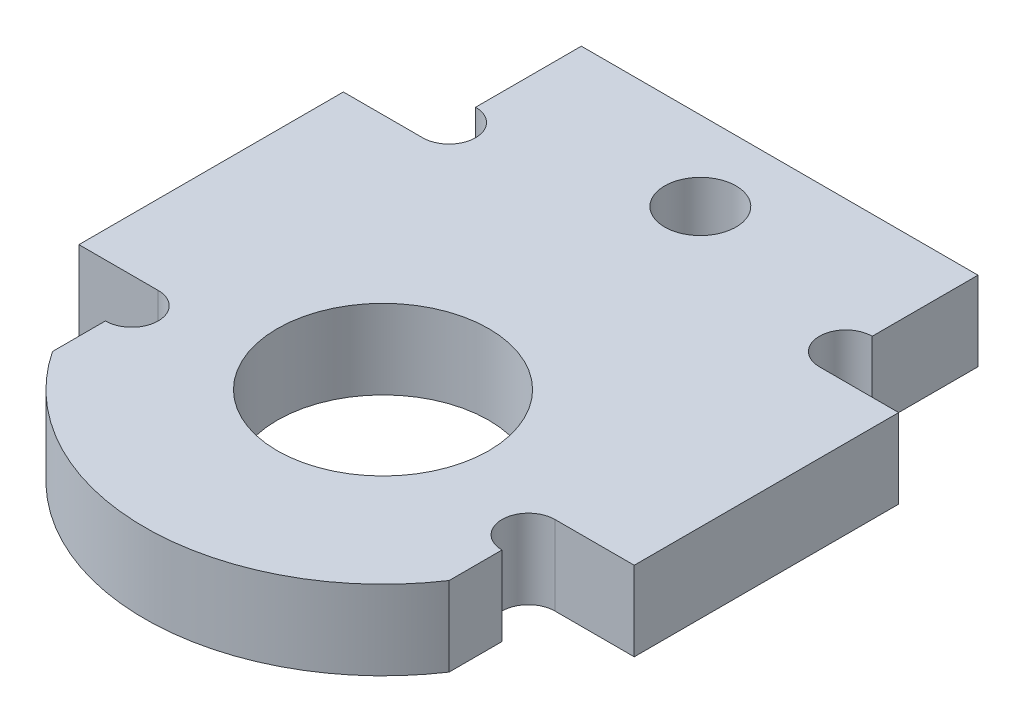
ISO-10303-21;
HEADER;
FILE_DESCRIPTION(('STEP AP214'),'2;1');
FILE_NAME('part.step','',(''),(''),'','','');
FILE_SCHEMA(('AUTOMOTIVE_DESIGN { 1 0 10303 214 1 1 1 1 }'));
ENDSEC;
DATA;
#1=APPLICATION_CONTEXT('core data for automotive mechanical design processes');
#2=APPLICATION_PROTOCOL_DEFINITION('international standard','automotive_design',2000,#1);
#3=PRODUCT_CONTEXT('',#1,'mechanical');
#4=PRODUCT('Part','Part','',(#3));
#5=PRODUCT_RELATED_PRODUCT_CATEGORY('part','',(#4));
#6=PRODUCT_DEFINITION_FORMATION('','',#4);
#7=PRODUCT_DEFINITION_CONTEXT('part definition',#1,'design');
#8=PRODUCT_DEFINITION('design','',#6,#7);
#9=PRODUCT_DEFINITION_SHAPE('','',#8);
#10=(LENGTH_UNIT() NAMED_UNIT(*) SI_UNIT(.MILLI.,.METRE.));
#11=(NAMED_UNIT(*) PLANE_ANGLE_UNIT() SI_UNIT($,.RADIAN.));
#12=(NAMED_UNIT(*) SI_UNIT($,.STERADIAN.) SOLID_ANGLE_UNIT());
#13=UNCERTAINTY_MEASURE_WITH_UNIT(LENGTH_MEASURE(1.E-05),#10,'distance_accuracy_value','');
#14=(GEOMETRIC_REPRESENTATION_CONTEXT(3) GLOBAL_UNCERTAINTY_ASSIGNED_CONTEXT((#13)) GLOBAL_UNIT_ASSIGNED_CONTEXT((#10,
#11,#12)) REPRESENTATION_CONTEXT('',''));
#15=CARTESIAN_POINT('',(0.,0.,0.));
#16=DIRECTION('',(0.,0.,1.));
#17=DIRECTION('',(1.,0.,0.));
#18=AXIS2_PLACEMENT_3D('',#15,#16,#17);
#19=CARTESIAN_POINT('',(7.5,3.,0.));
#20=DIRECTION('',(-1.,0.,0.));
#21=DIRECTION('',(0.,0.,1.));
#22=AXIS2_PLACEMENT_3D('',#19,#20,#21);
#23=PLANE('',#22);
#24=DIRECTION('',(0.,0.,-1.));
#25=VECTOR('',#24,1.);
#26=CARTESIAN_POINT('',(7.5,3.,0.));
#27=LINE('',#26,#25);
#28=CARTESIAN_POINT('',(7.5,3.,-11.));
#29=VERTEX_POINT('',#28);
#30=CARTESIAN_POINT('',(7.5,3.,-15.));
#31=VERTEX_POINT('',#30);
#32=EDGE_CURVE('E164',#29,#31,#27,.T.);
#33=ORIENTED_EDGE('',*,*,#32,.F.);
#34=DIRECTION('',(0.,-1.,0.));
#35=VECTOR('',#34,1.);
#36=CARTESIAN_POINT('',(7.5,3.,-11.));
#37=LINE('',#36,#35);
#38=CARTESIAN_POINT('',(7.5,0.,-11.));
#39=VERTEX_POINT('',#38);
#40=EDGE_CURVE('E149',#29,#39,#37,.T.);
#41=ORIENTED_EDGE('',*,*,#40,.T.);
#42=DIRECTION('',(0.,0.,-1.));
#43=VECTOR('',#42,1.);
#44=CARTESIAN_POINT('',(7.5,0.,0.));
#45=LINE('',#44,#43);
#46=CARTESIAN_POINT('',(7.5,0.,-15.));
#47=VERTEX_POINT('',#46);
#48=EDGE_CURVE('E162',#39,#47,#45,.T.);
#49=ORIENTED_EDGE('',*,*,#48,.T.);
#50=DIRECTION('',(0.,1.,0.));
#51=VECTOR('',#50,1.);
#52=CARTESIAN_POINT('',(7.5,-18.0277563773199,-15.));
#53=LINE('',#52,#51);
#54=EDGE_CURVE('E212',#47,#31,#53,.T.);
#55=ORIENTED_EDGE('',*,*,#54,.T.);
#56=EDGE_LOOP('',(#33,#41,#49,#55));
#57=FACE_BOUND('',#56,.T.);
#58=ADVANCED_FACE('F34',(#57),#23,.F.);
#59=CARTESIAN_POINT('',(-7.5,3.,5.));
#60=DIRECTION('',(1.,0.,0.));
#61=DIRECTION('',(0.,0.,-1.));
#62=AXIS2_PLACEMENT_3D('',#59,#60,#61);
#63=PLANE('',#62);
#64=DIRECTION('',(0.,0.,1.));
#65=VECTOR('',#64,1.);
#66=CARTESIAN_POINT('',(-7.5,3.,0.));
#67=LINE('',#66,#65);
#68=CARTESIAN_POINT('',(-7.5,3.,3.00000000000001));
#69=VERTEX_POINT('',#68);
#70=CARTESIAN_POINT('',(-7.5,3.,5.));
#71=VERTEX_POINT('',#70);
#72=EDGE_CURVE('E191',#69,#71,#67,.T.);
#73=ORIENTED_EDGE('',*,*,#72,.F.);
#74=DIRECTION('',(0.,-1.,0.));
#75=VECTOR('',#74,1.);
#76=CARTESIAN_POINT('',(-7.5,3.,3.00000000000001));
#77=LINE('',#76,#75);
#78=CARTESIAN_POINT('',(-7.5,0.,3.00000000000001));
#79=VERTEX_POINT('',#78);
#80=EDGE_CURVE('E273',#69,#79,#77,.T.);
#81=ORIENTED_EDGE('',*,*,#80,.T.);
#82=DIRECTION('',(0.,0.,1.));
#83=VECTOR('',#82,1.);
#84=CARTESIAN_POINT('',(-7.5,0.,5.));
#85=LINE('',#84,#83);
#86=CARTESIAN_POINT('',(-7.5,0.,5.));
#87=VERTEX_POINT('',#86);
#88=EDGE_CURVE('E195',#79,#87,#85,.T.);
#89=ORIENTED_EDGE('',*,*,#88,.T.);
#90=DIRECTION('',(0.,-1.,0.));
#91=VECTOR('',#90,1.);
#92=CARTESIAN_POINT('',(-7.5,3.,5.));
#93=LINE('',#92,#91);
#94=EDGE_CURVE('E11',#71,#87,#93,.T.);
#95=ORIENTED_EDGE('',*,*,#94,.F.);
#96=EDGE_LOOP('',(#73,#81,#89,#95));
#97=FACE_BOUND('',#96,.T.);
#98=ADVANCED_FACE('F314',(#97),#63,.F.);
#99=CARTESIAN_POINT('',(0.,3.,0.));
#100=DIRECTION('',(0.,1.,0.));
#101=DIRECTION('',(0.,0.,1.));
#102=AXIS2_PLACEMENT_3D('',#99,#100,#101);
#103=PLANE('',#102);
#104=CARTESIAN_POINT('',(0.,3.,-12.));
#105=DIRECTION('',(0.,-1.,0.));
#106=DIRECTION('',(0.,0.,-1.));
#107=AXIS2_PLACEMENT_3D('',#104,#105,#106);
#108=CIRCLE('',#107,1.35);
#109=CARTESIAN_POINT('',(0.,3.,-13.35));
#110=VERTEX_POINT('',#109);
#111=EDGE_CURVE('E284',#110,#110,#108,.T.);
#112=ORIENTED_EDGE('',*,*,#111,.T.);
#113=EDGE_LOOP('',(#112));
#114=FACE_BOUND('',#113,.T.);
#115=CARTESIAN_POINT('',(-7.5,3.,-10.));
#116=DIRECTION('',(0.,-1.,0.));
#117=DIRECTION('',(0.,0.,1.));
#118=AXIS2_PLACEMENT_3D('',#115,#116,#117);
#119=CIRCLE('',#118,1.);
#120=CARTESIAN_POINT('',(-7.5,3.,-11.));
#121=VERTEX_POINT('',#120);
#122=CARTESIAN_POINT('',(-7.5,3.,-9.));
#123=VERTEX_POINT('',#122);
#124=EDGE_CURVE('E283',#121,#123,#119,.T.);
#125=ORIENTED_EDGE('',*,*,#124,.T.);
#126=DIRECTION('',(-1.,0.,0.));
#127=VECTOR('',#126,1.);
#128=CARTESIAN_POINT('',(-7.5,3.,-9.));
#129=LINE('',#128,#127);
#130=CARTESIAN_POINT('',(-10.5,3.,-9.));
#131=VERTEX_POINT('',#130);
#132=EDGE_CURVE('E249',#123,#131,#129,.T.);
#133=ORIENTED_EDGE('',*,*,#132,.T.);
#134=DIRECTION('',(0.,0.,1.));
#135=VECTOR('',#134,1.);
#136=CARTESIAN_POINT('',(-10.5,3.,-9.));
#137=LINE('',#136,#135);
#138=CARTESIAN_POINT('',(-10.5,3.,1.));
#139=VERTEX_POINT('',#138);
#140=EDGE_CURVE('E246',#131,#139,#137,.T.);
#141=ORIENTED_EDGE('',*,*,#140,.T.);
#142=DIRECTION('',(1.,0.,0.));
#143=VECTOR('',#142,1.);
#144=CARTESIAN_POINT('',(-10.5,3.,1.));
#145=LINE('',#144,#143);
#146=CARTESIAN_POINT('',(-7.5,3.,1.));
#147=VERTEX_POINT('',#146);
#148=EDGE_CURVE('E236',#139,#147,#145,.T.);
#149=ORIENTED_EDGE('',*,*,#148,.T.);
#150=CARTESIAN_POINT('',(-7.5,3.,2.00000000000001));
#151=DIRECTION('',(0.,-1.,0.));
#152=DIRECTION('',(0.,0.,-1.));
#153=AXIS2_PLACEMENT_3D('',#150,#151,#152);
#154=CIRCLE('',#153,1.);
#155=EDGE_CURVE('E288',#147,#69,#154,.T.);
#156=ORIENTED_EDGE('',*,*,#155,.T.);
#157=ORIENTED_EDGE('',*,*,#72,.T.);
#158=CARTESIAN_POINT('',(0.,3.,0.));
#159=DIRECTION('',(0.,1.,0.));
#160=DIRECTION('',(0.,0.,1.));
#161=AXIS2_PLACEMENT_3D('',#158,#159,#160);
#162=CIRCLE('',#161,9.01387818865997);
#163=CARTESIAN_POINT('',(7.5,3.,5.));
#164=VERTEX_POINT('',#163);
#165=EDGE_CURVE('E180',#71,#164,#162,.T.);
#166=ORIENTED_EDGE('',*,*,#165,.T.);
#167=CARTESIAN_POINT('',(7.5,3.,3.00000000000001));
#168=VERTEX_POINT('',#167);
#169=EDGE_CURVE('E214',#164,#168,#27,.T.);
#170=ORIENTED_EDGE('',*,*,#169,.T.);
#171=CARTESIAN_POINT('',(7.5,3.,2.00000000000001));
#172=DIRECTION('',(0.,-1.,0.));
#173=DIRECTION('',(0.,0.,1.));
#174=AXIS2_PLACEMENT_3D('',#171,#172,#173);
#175=CIRCLE('',#174,1.);
#176=CARTESIAN_POINT('',(7.5,3.,1.));
#177=VERTEX_POINT('',#176);
#178=EDGE_CURVE('E157',#168,#177,#175,.T.);
#179=ORIENTED_EDGE('',*,*,#178,.T.);
#180=DIRECTION('',(1.,0.,0.));
#181=VECTOR('',#180,1.);
#182=CARTESIAN_POINT('',(10.5,3.,1.));
#183=LINE('',#182,#181);
#184=CARTESIAN_POINT('',(10.5,3.,1.));
#185=VERTEX_POINT('',#184);
#186=EDGE_CURVE('E270',#177,#185,#183,.T.);
#187=ORIENTED_EDGE('',*,*,#186,.T.);
#188=DIRECTION('',(0.,0.,-1.));
#189=VECTOR('',#188,1.);
#190=CARTESIAN_POINT('',(10.5,3.,-9.));
#191=LINE('',#190,#189);
#192=CARTESIAN_POINT('',(10.5,3.,-9.));
#193=VERTEX_POINT('',#192);
#194=EDGE_CURVE('E267',#185,#193,#191,.T.);
#195=ORIENTED_EDGE('',*,*,#194,.T.);
#196=DIRECTION('',(-1.,0.,0.));
#197=VECTOR('',#196,1.);
#198=CARTESIAN_POINT('',(7.5,3.,-9.));
#199=LINE('',#198,#197);
#200=CARTESIAN_POINT('',(7.5,3.,-9.));
#201=VERTEX_POINT('',#200);
#202=EDGE_CURVE('E260',#193,#201,#199,.T.);
#203=ORIENTED_EDGE('',*,*,#202,.T.);
#204=CARTESIAN_POINT('',(7.5,3.,-10.));
#205=DIRECTION('',(0.,-1.,0.));
#206=DIRECTION('',(0.,0.,-1.));
#207=AXIS2_PLACEMENT_3D('',#204,#205,#206);
#208=CIRCLE('',#207,1.);
#209=EDGE_CURVE('E156',#201,#29,#208,.T.);
#210=ORIENTED_EDGE('',*,*,#209,.T.);
#211=ORIENTED_EDGE('',*,*,#32,.T.);
#212=DIRECTION('',(-1.,0.,0.));
#213=VECTOR('',#212,1.);
#214=CARTESIAN_POINT('',(-7.5,3.,-15.));
#215=LINE('',#214,#213);
#216=CARTESIAN_POINT('',(-7.5,3.,-15.));
#217=VERTEX_POINT('',#216);
#218=EDGE_CURVE('E221',#31,#217,#215,.T.);
#219=ORIENTED_EDGE('',*,*,#218,.T.);
#220=EDGE_CURVE('E185',#217,#121,#67,.T.);
#221=ORIENTED_EDGE('',*,*,#220,.T.);
#222=EDGE_LOOP('',(#125,#133,#141,#149,#156,#157,#166,#170,#179,#187,#195,#203,#210,#211,#219,#221));
#223=FACE_BOUND('',#222,.T.);
#224=CARTESIAN_POINT('',(0.,3.,0.));
#225=DIRECTION('',(0.,1.,0.));
#226=DIRECTION('',(0.,0.,1.));
#227=AXIS2_PLACEMENT_3D('',#224,#225,#226);
#228=CIRCLE('',#227,4.);
#229=CARTESIAN_POINT('',(0.,3.,4.));
#230=VERTEX_POINT('',#229);
#231=EDGE_CURVE('E199',#230,#230,#228,.T.);
#232=ORIENTED_EDGE('',*,*,#231,.F.);
#233=EDGE_LOOP('',(#232));
#234=FACE_BOUND('',#233,.T.);
#235=ADVANCED_FACE('F218',(#114,#223,#234),#103,.T.);
#236=CARTESIAN_POINT('',(0.,0.,0.));
#237=DIRECTION('',(0.,1.,0.));
#238=DIRECTION('',(0.,0.,1.));
#239=AXIS2_PLACEMENT_3D('',#236,#237,#238);
#240=PLANE('',#239);
#241=CARTESIAN_POINT('',(0.,0.,-12.));
#242=DIRECTION('',(0.,-1.,0.));
#243=DIRECTION('',(0.,0.,-1.));
#244=AXIS2_PLACEMENT_3D('',#241,#242,#243);
#245=CIRCLE('',#244,1.35);
#246=CARTESIAN_POINT('',(0.,0.,-13.35));
#247=VERTEX_POINT('',#246);
#248=EDGE_CURVE('E293',#247,#247,#245,.T.);
#249=ORIENTED_EDGE('',*,*,#248,.F.);
#250=EDGE_LOOP('',(#249));
#251=FACE_BOUND('',#250,.T.);
#252=DIRECTION('',(1.,0.,0.));
#253=VECTOR('',#252,1.);
#254=CARTESIAN_POINT('',(-7.5,0.,-9.));
#255=LINE('',#254,#253);
#256=CARTESIAN_POINT('',(-10.5,0.,-9.));
#257=VERTEX_POINT('',#256);
#258=CARTESIAN_POINT('',(-7.5,0.,-9.));
#259=VERTEX_POINT('',#258);
#260=EDGE_CURVE('E227',#257,#259,#255,.T.);
#261=ORIENTED_EDGE('',*,*,#260,.T.);
#262=CARTESIAN_POINT('',(-7.5,0.,-10.));
#263=DIRECTION('',(0.,-1.,0.));
#264=DIRECTION('',(0.,0.,1.));
#265=AXIS2_PLACEMENT_3D('',#262,#263,#264);
#266=CIRCLE('',#265,1.);
#267=CARTESIAN_POINT('',(-7.5,0.,-11.));
#268=VERTEX_POINT('',#267);
#269=EDGE_CURVE('E57',#268,#259,#266,.T.);
#270=ORIENTED_EDGE('',*,*,#269,.F.);
#271=CARTESIAN_POINT('',(-7.5,0.,-15.));
#272=VERTEX_POINT('',#271);
#273=EDGE_CURVE('E176',#272,#268,#85,.T.);
#274=ORIENTED_EDGE('',*,*,#273,.F.);
#275=DIRECTION('',(1.,0.,0.));
#276=VECTOR('',#275,1.);
#277=CARTESIAN_POINT('',(-7.5,0.,-15.));
#278=LINE('',#277,#276);
#279=EDGE_CURVE('E170',#272,#47,#278,.T.);
#280=ORIENTED_EDGE('',*,*,#279,.T.);
#281=ORIENTED_EDGE('',*,*,#48,.F.);
#282=CARTESIAN_POINT('',(7.5,0.,-10.));
#283=DIRECTION('',(0.,-1.,0.));
#284=DIRECTION('',(0.,0.,-1.));
#285=AXIS2_PLACEMENT_3D('',#282,#283,#284);
#286=CIRCLE('',#285,1.);
#287=CARTESIAN_POINT('',(7.5,0.,-9.));
#288=VERTEX_POINT('',#287);
#289=EDGE_CURVE('E146',#288,#39,#286,.T.);
#290=ORIENTED_EDGE('',*,*,#289,.F.);
#291=DIRECTION('',(1.,0.,0.));
#292=VECTOR('',#291,1.);
#293=CARTESIAN_POINT('',(7.5,0.,-9.));
#294=LINE('',#293,#292);
#295=CARTESIAN_POINT('',(10.5,0.,-9.));
#296=VERTEX_POINT('',#295);
#297=EDGE_CURVE('E265',#288,#296,#294,.T.);
#298=ORIENTED_EDGE('',*,*,#297,.T.);
#299=DIRECTION('',(0.,0.,1.));
#300=VECTOR('',#299,1.);
#301=CARTESIAN_POINT('',(10.5,0.,-9.));
#302=LINE('',#301,#300);
#303=CARTESIAN_POINT('',(10.5,0.,1.));
#304=VERTEX_POINT('',#303);
#305=EDGE_CURVE('E252',#296,#304,#302,.T.);
#306=ORIENTED_EDGE('',*,*,#305,.T.);
#307=DIRECTION('',(-1.,0.,0.));
#308=VECTOR('',#307,1.);
#309=CARTESIAN_POINT('',(10.5,0.,1.));
#310=LINE('',#309,#308);
#311=CARTESIAN_POINT('',(7.5,0.,1.));
#312=VERTEX_POINT('',#311);
#313=EDGE_CURVE('E256',#304,#312,#310,.T.);
#314=ORIENTED_EDGE('',*,*,#313,.T.);
#315=CARTESIAN_POINT('',(7.5,0.,2.00000000000001));
#316=DIRECTION('',(0.,-1.,0.));
#317=DIRECTION('',(0.,0.,1.));
#318=AXIS2_PLACEMENT_3D('',#315,#316,#317);
#319=CIRCLE('',#318,1.);
#320=CARTESIAN_POINT('',(7.5,0.,3.00000000000001));
#321=VERTEX_POINT('',#320);
#322=EDGE_CURVE('E49',#321,#312,#319,.T.);
#323=ORIENTED_EDGE('',*,*,#322,.F.);
#324=CARTESIAN_POINT('',(7.5,0.,5.));
#325=VERTEX_POINT('',#324);
#326=EDGE_CURVE('E172',#325,#321,#45,.T.);
#327=ORIENTED_EDGE('',*,*,#326,.F.);
#328=CARTESIAN_POINT('',(0.,0.,0.));
#329=DIRECTION('',(0.,1.,0.));
#330=DIRECTION('',(0.,0.,1.));
#331=AXIS2_PLACEMENT_3D('',#328,#329,#330);
#332=CIRCLE('',#331,9.01387818865997);
#333=EDGE_CURVE('E173',#87,#325,#332,.T.);
#334=ORIENTED_EDGE('',*,*,#333,.F.);
#335=ORIENTED_EDGE('',*,*,#88,.F.);
#336=CARTESIAN_POINT('',(-7.5,0.,2.00000000000001));
#337=DIRECTION('',(0.,-1.,0.));
#338=DIRECTION('',(0.,0.,-1.));
#339=AXIS2_PLACEMENT_3D('',#336,#337,#338);
#340=CIRCLE('',#339,1.);
#341=CARTESIAN_POINT('',(-7.5,0.,1.));
#342=VERTEX_POINT('',#341);
#343=EDGE_CURVE('E286',#342,#79,#340,.T.);
#344=ORIENTED_EDGE('',*,*,#343,.F.);
#345=DIRECTION('',(-1.,0.,0.));
#346=VECTOR('',#345,1.);
#347=CARTESIAN_POINT('',(-10.5,0.,1.));
#348=LINE('',#347,#346);
#349=CARTESIAN_POINT('',(-10.5,0.,1.));
#350=VERTEX_POINT('',#349);
#351=EDGE_CURVE('E229',#342,#350,#348,.T.);
#352=ORIENTED_EDGE('',*,*,#351,.T.);
#353=DIRECTION('',(0.,0.,-1.));
#354=VECTOR('',#353,1.);
#355=CARTESIAN_POINT('',(-10.5,0.,-9.));
#356=LINE('',#355,#354);
#357=EDGE_CURVE('E243',#350,#257,#356,.T.);
#358=ORIENTED_EDGE('',*,*,#357,.T.);
#359=EDGE_LOOP('',(#261,#270,#274,#280,#281,#290,#298,#306,#314,#323,#327,#334,#335,#344,#352,#358));
#360=FACE_BOUND('',#359,.T.);
#361=CARTESIAN_POINT('',(0.,0.,0.));
#362=DIRECTION('',(0.,1.,0.));
#363=DIRECTION('',(0.,0.,1.));
#364=AXIS2_PLACEMENT_3D('',#361,#362,#363);
#365=CIRCLE('',#364,4.);
#366=CARTESIAN_POINT('',(0.,0.,4.));
#367=VERTEX_POINT('',#366);
#368=EDGE_CURVE('E205',#367,#367,#365,.T.);
#369=ORIENTED_EDGE('',*,*,#368,.T.);
#370=EDGE_LOOP('',(#369));
#371=FACE_BOUND('',#370,.T.);
#372=ADVANCED_FACE('F167',(#251,#360,#371),#240,.F.);
#373=ORIENTED_EDGE('',*,*,#273,.T.);
#374=DIRECTION('',(0.,-1.,0.));
#375=VECTOR('',#374,1.);
#376=CARTESIAN_POINT('',(-7.5,3.,-11.));
#377=LINE('',#376,#375);
#378=EDGE_CURVE('E277',#268,#121,#377,.F.);
#379=ORIENTED_EDGE('',*,*,#378,.T.);
#380=ORIENTED_EDGE('',*,*,#220,.F.);
#381=DIRECTION('',(0.,1.,0.));
#382=VECTOR('',#381,1.);
#383=CARTESIAN_POINT('',(-7.5,-18.0277563773199,-15.));
#384=LINE('',#383,#382);
#385=EDGE_CURVE('E224',#272,#217,#384,.T.);
#386=ORIENTED_EDGE('',*,*,#385,.F.);
#387=EDGE_LOOP('',(#373,#379,#380,#386));
#388=FACE_BOUND('',#387,.T.);
#389=ADVANCED_FACE('F36',(#388),#63,.F.);
#390=CARTESIAN_POINT('',(0.,3.,0.));
#391=DIRECTION('',(0.,-1.,0.));
#392=DIRECTION('',(0.,0.,-1.));
#393=AXIS2_PLACEMENT_3D('',#390,#391,#392);
#394=CYLINDRICAL_SURFACE('',#393,9.01387818865997);
#395=ORIENTED_EDGE('',*,*,#333,.T.);
#396=DIRECTION('',(0.,-1.,0.));
#397=VECTOR('',#396,1.);
#398=CARTESIAN_POINT('',(7.5,3.,5.));
#399=LINE('',#398,#397);
#400=EDGE_CURVE('E42',#164,#325,#399,.T.);
#401=ORIENTED_EDGE('',*,*,#400,.F.);
#402=ORIENTED_EDGE('',*,*,#165,.F.);
#403=ORIENTED_EDGE('',*,*,#94,.T.);
#404=EDGE_LOOP('',(#395,#401,#402,#403));
#405=FACE_BOUND('',#404,.T.);
#406=ADVANCED_FACE('F313',(#405),#394,.T.);
#407=ORIENTED_EDGE('',*,*,#326,.T.);
#408=DIRECTION('',(0.,-1.,0.));
#409=VECTOR('',#408,1.);
#410=CARTESIAN_POINT('',(7.5,3.,3.00000000000001));
#411=LINE('',#410,#409);
#412=EDGE_CURVE('E165',#321,#168,#411,.F.);
#413=ORIENTED_EDGE('',*,*,#412,.T.);
#414=ORIENTED_EDGE('',*,*,#169,.F.);
#415=ORIENTED_EDGE('',*,*,#400,.T.);
#416=EDGE_LOOP('',(#407,#413,#414,#415));
#417=FACE_BOUND('',#416,.T.);
#418=ADVANCED_FACE('F318',(#417),#23,.F.);
#419=CARTESIAN_POINT('',(0.,3.,0.));
#420=DIRECTION('',(0.,-1.,0.));
#421=DIRECTION('',(0.,0.,-1.));
#422=AXIS2_PLACEMENT_3D('',#419,#420,#421);
#423=CYLINDRICAL_SURFACE('',#422,4.);
#424=ORIENTED_EDGE('',*,*,#231,.T.);
#425=EDGE_LOOP('',(#424));
#426=FACE_BOUND('',#425,.T.);
#427=ORIENTED_EDGE('',*,*,#368,.F.);
#428=EDGE_LOOP('',(#427));
#429=FACE_BOUND('',#428,.T.);
#430=ADVANCED_FACE('F323',(#426,#429),#423,.F.);
#431=CARTESIAN_POINT('',(-7.5,-18.0277563773199,-15.));
#432=DIRECTION('',(0.,0.,-1.));
#433=DIRECTION('',(-1.,0.,0.));
#434=AXIS2_PLACEMENT_3D('',#431,#432,#433);
#435=PLANE('',#434);
#436=ORIENTED_EDGE('',*,*,#279,.F.);
#437=ORIENTED_EDGE('',*,*,#385,.T.);
#438=ORIENTED_EDGE('',*,*,#218,.F.);
#439=ORIENTED_EDGE('',*,*,#54,.F.);
#440=EDGE_LOOP('',(#436,#437,#438,#439));
#441=FACE_BOUND('',#440,.T.);
#442=ADVANCED_FACE('F226',(#441),#435,.T.);
#443=CARTESIAN_POINT('',(-10.5,-10.4403065089106,1.));
#444=DIRECTION('',(0.,0.,1.));
#445=DIRECTION('',(1.,0.,0.));
#446=AXIS2_PLACEMENT_3D('',#443,#444,#445);
#447=PLANE('',#446);
#448=ORIENTED_EDGE('',*,*,#351,.F.);
#449=DIRECTION('',(0.,1.,0.));
#450=VECTOR('',#449,1.);
#451=CARTESIAN_POINT('',(-7.5,-10.4403065089106,1.));
#452=LINE('',#451,#450);
#453=EDGE_CURVE('E240',#342,#147,#452,.T.);
#454=ORIENTED_EDGE('',*,*,#453,.T.);
#455=ORIENTED_EDGE('',*,*,#148,.F.);
#456=DIRECTION('',(0.,1.,0.));
#457=VECTOR('',#456,1.);
#458=CARTESIAN_POINT('',(-10.5,-10.4403065089106,1.));
#459=LINE('',#458,#457);
#460=EDGE_CURVE('E238',#350,#139,#459,.T.);
#461=ORIENTED_EDGE('',*,*,#460,.F.);
#462=EDGE_LOOP('',(#448,#454,#455,#461));
#463=FACE_BOUND('',#462,.T.);
#464=ADVANCED_FACE('F358',(#463),#447,.T.);
#465=CARTESIAN_POINT('',(-10.5,-10.4403065089106,-9.));
#466=DIRECTION('',(-1.,0.,0.));
#467=DIRECTION('',(0.,0.,1.));
#468=AXIS2_PLACEMENT_3D('',#465,#466,#467);
#469=PLANE('',#468);
#470=ORIENTED_EDGE('',*,*,#357,.F.);
#471=ORIENTED_EDGE('',*,*,#460,.T.);
#472=ORIENTED_EDGE('',*,*,#140,.F.);
#473=DIRECTION('',(0.,1.,0.));
#474=VECTOR('',#473,1.);
#475=CARTESIAN_POINT('',(-10.5,-10.4403065089106,-9.));
#476=LINE('',#475,#474);
#477=EDGE_CURVE('E235',#257,#131,#476,.T.);
#478=ORIENTED_EDGE('',*,*,#477,.F.);
#479=EDGE_LOOP('',(#470,#471,#472,#478));
#480=FACE_BOUND('',#479,.T.);
#481=ADVANCED_FACE('F361',(#480),#469,.T.);
#482=CARTESIAN_POINT('',(-7.5,-10.4403065089106,-9.));
#483=DIRECTION('',(0.,0.,-1.));
#484=DIRECTION('',(-1.,0.,0.));
#485=AXIS2_PLACEMENT_3D('',#482,#483,#484);
#486=PLANE('',#485);
#487=ORIENTED_EDGE('',*,*,#260,.F.);
#488=ORIENTED_EDGE('',*,*,#477,.T.);
#489=ORIENTED_EDGE('',*,*,#132,.F.);
#490=DIRECTION('',(0.,1.,0.));
#491=VECTOR('',#490,1.);
#492=CARTESIAN_POINT('',(-7.5,-10.4403065089106,-9.));
#493=LINE('',#492,#491);
#494=EDGE_CURVE('E233',#259,#123,#493,.T.);
#495=ORIENTED_EDGE('',*,*,#494,.F.);
#496=EDGE_LOOP('',(#487,#488,#489,#495));
#497=FACE_BOUND('',#496,.T.);
#498=ADVANCED_FACE('F353',(#497),#486,.T.);
#499=CARTESIAN_POINT('',(10.5,-10.4403065089106,1.));
#500=DIRECTION('',(0.,0.,1.));
#501=DIRECTION('',(1.,0.,0.));
#502=AXIS2_PLACEMENT_3D('',#499,#500,#501);
#503=PLANE('',#502);
#504=ORIENTED_EDGE('',*,*,#313,.F.);
#505=DIRECTION('',(0.,1.,0.));
#506=VECTOR('',#505,1.);
#507=CARTESIAN_POINT('',(10.5,-10.4403065089106,1.));
#508=LINE('',#507,#506);
#509=EDGE_CURVE('E257',#304,#185,#508,.T.);
#510=ORIENTED_EDGE('',*,*,#509,.T.);
#511=ORIENTED_EDGE('',*,*,#186,.F.);
#512=DIRECTION('',(0.,1.,0.));
#513=VECTOR('',#512,1.);
#514=CARTESIAN_POINT('',(7.5,-10.4403065089106,1.));
#515=LINE('',#514,#513);
#516=EDGE_CURVE('E263',#312,#177,#515,.T.);
#517=ORIENTED_EDGE('',*,*,#516,.F.);
#518=EDGE_LOOP('',(#504,#510,#511,#517));
#519=FACE_BOUND('',#518,.T.);
#520=ADVANCED_FACE('F337',(#519),#503,.T.);
#521=CARTESIAN_POINT('',(7.5,-10.4403065089106,-9.));
#522=DIRECTION('',(0.,0.,-1.));
#523=DIRECTION('',(-1.,0.,0.));
#524=AXIS2_PLACEMENT_3D('',#521,#522,#523);
#525=PLANE('',#524);
#526=ORIENTED_EDGE('',*,*,#297,.F.);
#527=DIRECTION('',(0.,1.,0.));
#528=VECTOR('',#527,1.);
#529=CARTESIAN_POINT('',(7.5,-10.4403065089106,-9.));
#530=LINE('',#529,#528);
#531=EDGE_CURVE('E152',#288,#201,#530,.T.);
#532=ORIENTED_EDGE('',*,*,#531,.T.);
#533=ORIENTED_EDGE('',*,*,#202,.F.);
#534=DIRECTION('',(0.,1.,0.));
#535=VECTOR('',#534,1.);
#536=CARTESIAN_POINT('',(10.5,-10.4403065089106,-9.));
#537=LINE('',#536,#535);
#538=EDGE_CURVE('E259',#296,#193,#537,.T.);
#539=ORIENTED_EDGE('',*,*,#538,.F.);
#540=EDGE_LOOP('',(#526,#532,#533,#539));
#541=FACE_BOUND('',#540,.T.);
#542=ADVANCED_FACE('F345',(#541),#525,.T.);
#543=CARTESIAN_POINT('',(10.5,-10.4403065089106,-9.));
#544=DIRECTION('',(1.,0.,0.));
#545=DIRECTION('',(0.,0.,-1.));
#546=AXIS2_PLACEMENT_3D('',#543,#544,#545);
#547=PLANE('',#546);
#548=ORIENTED_EDGE('',*,*,#305,.F.);
#549=ORIENTED_EDGE('',*,*,#538,.T.);
#550=ORIENTED_EDGE('',*,*,#194,.F.);
#551=ORIENTED_EDGE('',*,*,#509,.F.);
#552=EDGE_LOOP('',(#548,#549,#550,#551));
#553=FACE_BOUND('',#552,.T.);
#554=ADVANCED_FACE('F342',(#553),#547,.T.);
#555=CARTESIAN_POINT('',(7.5,3.,-10.));
#556=DIRECTION('',(0.,-1.,0.));
#557=DIRECTION('',(0.,0.,-1.));
#558=AXIS2_PLACEMENT_3D('',#555,#556,#557);
#559=CYLINDRICAL_SURFACE('',#558,1.);
#560=ORIENTED_EDGE('',*,*,#209,.F.);
#561=ORIENTED_EDGE('',*,*,#531,.F.);
#562=ORIENTED_EDGE('',*,*,#289,.T.);
#563=ORIENTED_EDGE('',*,*,#40,.F.);
#564=EDGE_LOOP('',(#560,#561,#562,#563));
#565=FACE_BOUND('',#564,.T.);
#566=ADVANCED_FACE('F148',(#565),#559,.F.);
#567=CARTESIAN_POINT('',(7.5,3.,2.00000000000001));
#568=DIRECTION('',(0.,-1.,0.));
#569=DIRECTION('',(0.,0.,-1.));
#570=AXIS2_PLACEMENT_3D('',#567,#568,#569);
#571=CYLINDRICAL_SURFACE('',#570,1.);
#572=ORIENTED_EDGE('',*,*,#322,.T.);
#573=ORIENTED_EDGE('',*,*,#516,.T.);
#574=ORIENTED_EDGE('',*,*,#178,.F.);
#575=ORIENTED_EDGE('',*,*,#412,.F.);
#576=EDGE_LOOP('',(#572,#573,#574,#575));
#577=FACE_BOUND('',#576,.T.);
#578=ADVANCED_FACE('F338',(#577),#571,.F.);
#579=CARTESIAN_POINT('',(-7.5,3.,-10.));
#580=DIRECTION('',(0.,-1.,0.));
#581=DIRECTION('',(0.,0.,-1.));
#582=AXIS2_PLACEMENT_3D('',#579,#580,#581);
#583=CYLINDRICAL_SURFACE('',#582,1.);
#584=ORIENTED_EDGE('',*,*,#269,.T.);
#585=ORIENTED_EDGE('',*,*,#494,.T.);
#586=ORIENTED_EDGE('',*,*,#124,.F.);
#587=ORIENTED_EDGE('',*,*,#378,.F.);
#588=EDGE_LOOP('',(#584,#585,#586,#587));
#589=FACE_BOUND('',#588,.T.);
#590=ADVANCED_FACE('F412',(#589),#583,.F.);
#591=CARTESIAN_POINT('',(-7.5,3.,2.00000000000001));
#592=DIRECTION('',(0.,-1.,0.));
#593=DIRECTION('',(0.,0.,-1.));
#594=AXIS2_PLACEMENT_3D('',#591,#592,#593);
#595=CYLINDRICAL_SURFACE('',#594,1.);
#596=ORIENTED_EDGE('',*,*,#155,.F.);
#597=ORIENTED_EDGE('',*,*,#453,.F.);
#598=ORIENTED_EDGE('',*,*,#343,.T.);
#599=ORIENTED_EDGE('',*,*,#80,.F.);
#600=EDGE_LOOP('',(#596,#597,#598,#599));
#601=FACE_BOUND('',#600,.T.);
#602=ADVANCED_FACE('F303',(#601),#595,.F.);
#603=CARTESIAN_POINT('',(0.,3.,-12.));
#604=DIRECTION('',(0.,-1.,0.));
#605=DIRECTION('',(0.,0.,-1.));
#606=AXIS2_PLACEMENT_3D('',#603,#604,#605);
#607=CYLINDRICAL_SURFACE('',#606,1.35);
#608=ORIENTED_EDGE('',*,*,#111,.F.);
#609=EDGE_LOOP('',(#608));
#610=FACE_BOUND('',#609,.T.);
#611=ORIENTED_EDGE('',*,*,#248,.T.);
#612=EDGE_LOOP('',(#611));
#613=FACE_BOUND('',#612,.T.);
#614=ADVANCED_FACE('F300',(#610,#613),#607,.F.);
#615=CLOSED_SHELL('',(#58,#98,#235,#372,#389,#406,#418,#430,#442,#464,#481,#498,#520,#542,#554,
#566,#578,#590,#602,#614));
#616=MANIFOLD_SOLID_BREP('B2',#615);
#617=ADVANCED_BREP_SHAPE_REPRESENTATION('',(#18,#616),#14);
#618=SHAPE_DEFINITION_REPRESENTATION(#9,#617);
ENDSEC;
END-ISO-10303-21;
